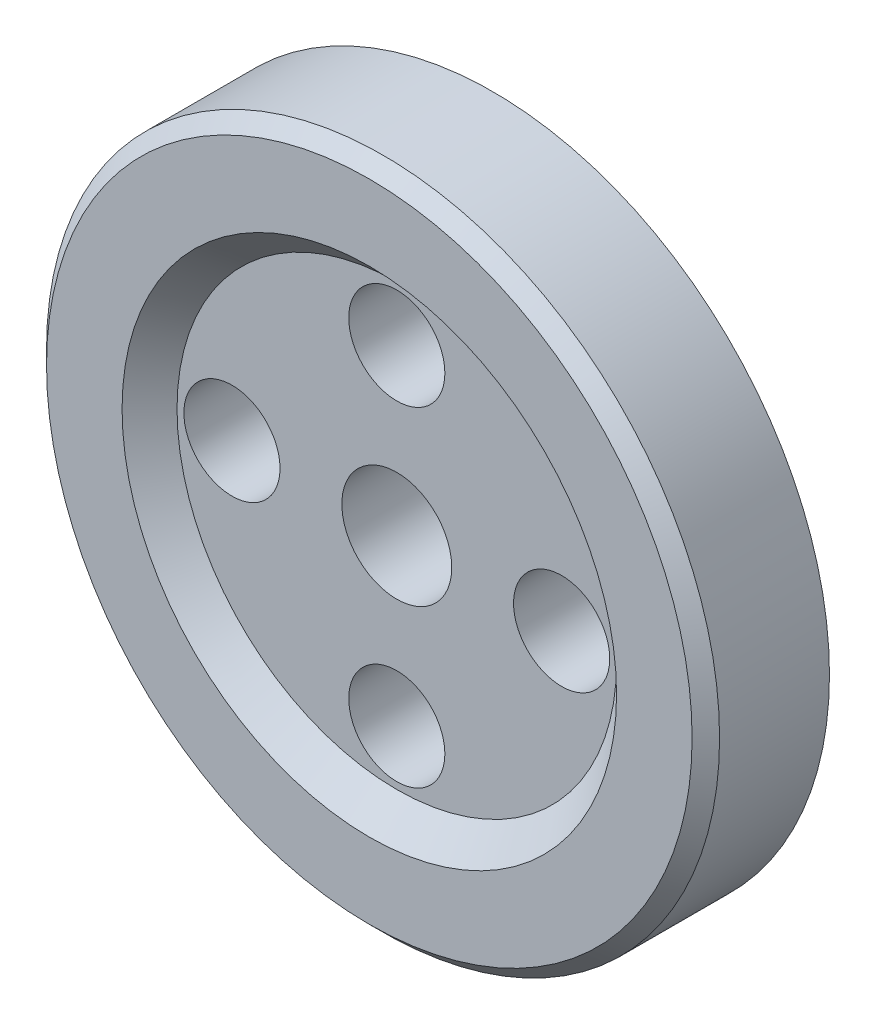
ISO-10303-21;
HEADER;
FILE_DESCRIPTION(('STEP AP214'),'2;1');
FILE_NAME('part.step','',(''),(''),'','','');
FILE_SCHEMA(('AUTOMOTIVE_DESIGN { 1 0 10303 214 1 1 1 1 }'));
ENDSEC;
DATA;
#1=APPLICATION_CONTEXT('core data for automotive mechanical design processes');
#2=APPLICATION_PROTOCOL_DEFINITION('international standard','automotive_design',2000,#1);
#3=PRODUCT_CONTEXT('',#1,'mechanical');
#4=PRODUCT('Part','Part','',(#3));
#5=PRODUCT_RELATED_PRODUCT_CATEGORY('part','',(#4));
#6=PRODUCT_DEFINITION_FORMATION('','',#4);
#7=PRODUCT_DEFINITION_CONTEXT('part definition',#1,'design');
#8=PRODUCT_DEFINITION('design','',#6,#7);
#9=PRODUCT_DEFINITION_SHAPE('','',#8);
#10=(LENGTH_UNIT() NAMED_UNIT(*) SI_UNIT(.MILLI.,.METRE.));
#11=(NAMED_UNIT(*) PLANE_ANGLE_UNIT() SI_UNIT($,.RADIAN.));
#12=(NAMED_UNIT(*) SI_UNIT($,.STERADIAN.) SOLID_ANGLE_UNIT());
#13=UNCERTAINTY_MEASURE_WITH_UNIT(LENGTH_MEASURE(1.E-05),#10,'distance_accuracy_value','');
#14=(GEOMETRIC_REPRESENTATION_CONTEXT(3) GLOBAL_UNCERTAINTY_ASSIGNED_CONTEXT((#13)) GLOBAL_UNIT_ASSIGNED_CONTEXT((#10,
#11,#12)) REPRESENTATION_CONTEXT('',''));
#15=CARTESIAN_POINT('',(0.,0.,0.));
#16=DIRECTION('',(0.,0.,1.));
#17=DIRECTION('',(1.,0.,0.));
#18=AXIS2_PLACEMENT_3D('',#15,#16,#17);
#19=CARTESIAN_POINT('',(0.,12.,4.5));
#20=DIRECTION('',(0.,0.,-1.));
#21=DIRECTION('',(-1.,0.,0.));
#22=AXIS2_PLACEMENT_3D('',#19,#20,#21);
#23=CYLINDRICAL_SURFACE('',#22,3.5);
#24=CARTESIAN_POINT('',(0.,12.,-4.5));
#25=DIRECTION('',(0.,0.,1.));
#26=DIRECTION('',(1.,0.,0.));
#27=AXIS2_PLACEMENT_3D('',#24,#25,#26);
#28=CIRCLE('',#27,3.5);
#29=CARTESIAN_POINT('',(3.5,12.,-4.5));
#30=VERTEX_POINT('',#29);
#31=EDGE_CURVE('E60',#30,#30,#28,.T.);
#32=ORIENTED_EDGE('',*,*,#31,.F.);
#33=EDGE_LOOP('',(#32));
#34=FACE_BOUND('',#33,.T.);
#35=CARTESIAN_POINT('',(0.,12.,2.5));
#36=DIRECTION('',(0.,0.,1.));
#37=DIRECTION('',(1.,0.,0.));
#38=AXIS2_PLACEMENT_3D('',#35,#36,#37);
#39=CIRCLE('',#38,3.5);
#40=CARTESIAN_POINT('',(3.5,12.,2.5));
#41=VERTEX_POINT('',#40);
#42=EDGE_CURVE('E75',#41,#41,#39,.T.);
#43=ORIENTED_EDGE('',*,*,#42,.T.);
#44=EDGE_LOOP('',(#43));
#45=FACE_BOUND('',#44,.T.);
#46=ADVANCED_FACE('F34',(#34,#45),#23,.F.);
#47=CARTESIAN_POINT('',(-12.,0.,4.5));
#48=DIRECTION('',(0.,0.,-1.));
#49=DIRECTION('',(-1.,0.,0.));
#50=AXIS2_PLACEMENT_3D('',#47,#48,#49);
#51=CYLINDRICAL_SURFACE('',#50,3.5);
#52=CARTESIAN_POINT('',(-12.,0.,-4.5));
#53=DIRECTION('',(0.,0.,1.));
#54=DIRECTION('',(1.,0.,0.));
#55=AXIS2_PLACEMENT_3D('',#52,#53,#54);
#56=CIRCLE('',#55,3.5);
#57=CARTESIAN_POINT('',(-8.5,0.,-4.5));
#58=VERTEX_POINT('',#57);
#59=EDGE_CURVE('E63',#58,#58,#56,.T.);
#60=ORIENTED_EDGE('',*,*,#59,.F.);
#61=EDGE_LOOP('',(#60));
#62=FACE_BOUND('',#61,.T.);
#63=CARTESIAN_POINT('',(-12.,0.,2.5));
#64=DIRECTION('',(0.,0.,1.));
#65=DIRECTION('',(1.,0.,0.));
#66=AXIS2_PLACEMENT_3D('',#63,#64,#65);
#67=CIRCLE('',#66,3.5);
#68=CARTESIAN_POINT('',(-8.5,0.,2.5));
#69=VERTEX_POINT('',#68);
#70=EDGE_CURVE('E78',#69,#69,#67,.T.);
#71=ORIENTED_EDGE('',*,*,#70,.T.);
#72=EDGE_LOOP('',(#71));
#73=FACE_BOUND('',#72,.T.);
#74=ADVANCED_FACE('F106',(#62,#73),#51,.F.);
#75=CARTESIAN_POINT('',(0.,-12.,4.5));
#76=DIRECTION('',(0.,0.,-1.));
#77=DIRECTION('',(-1.,0.,0.));
#78=AXIS2_PLACEMENT_3D('',#75,#76,#77);
#79=CYLINDRICAL_SURFACE('',#78,3.5);
#80=CARTESIAN_POINT('',(0.,-12.,-4.5));
#81=DIRECTION('',(0.,0.,1.));
#82=DIRECTION('',(1.,0.,0.));
#83=AXIS2_PLACEMENT_3D('',#80,#81,#82);
#84=CIRCLE('',#83,3.5);
#85=CARTESIAN_POINT('',(3.5,-12.,-4.5));
#86=VERTEX_POINT('',#85);
#87=EDGE_CURVE('E66',#86,#86,#84,.T.);
#88=ORIENTED_EDGE('',*,*,#87,.F.);
#89=EDGE_LOOP('',(#88));
#90=FACE_BOUND('',#89,.T.);
#91=CARTESIAN_POINT('',(0.,-12.,2.5));
#92=DIRECTION('',(0.,0.,1.));
#93=DIRECTION('',(1.,0.,0.));
#94=AXIS2_PLACEMENT_3D('',#91,#92,#93);
#95=CIRCLE('',#94,3.5);
#96=CARTESIAN_POINT('',(3.5,-12.,2.5));
#97=VERTEX_POINT('',#96);
#98=EDGE_CURVE('E81',#97,#97,#95,.T.);
#99=ORIENTED_EDGE('',*,*,#98,.T.);
#100=EDGE_LOOP('',(#99));
#101=FACE_BOUND('',#100,.T.);
#102=ADVANCED_FACE('F112',(#90,#101),#79,.F.);
#103=CARTESIAN_POINT('',(12.,0.,4.5));
#104=DIRECTION('',(0.,0.,-1.));
#105=DIRECTION('',(-1.,0.,0.));
#106=AXIS2_PLACEMENT_3D('',#103,#104,#105);
#107=CYLINDRICAL_SURFACE('',#106,3.5);
#108=CARTESIAN_POINT('',(12.,0.,-4.5));
#109=DIRECTION('',(0.,0.,1.));
#110=DIRECTION('',(1.,0.,0.));
#111=AXIS2_PLACEMENT_3D('',#108,#109,#110);
#112=CIRCLE('',#111,3.5);
#113=CARTESIAN_POINT('',(15.5,0.,-4.5));
#114=VERTEX_POINT('',#113);
#115=EDGE_CURVE('E69',#114,#114,#112,.T.);
#116=ORIENTED_EDGE('',*,*,#115,.F.);
#117=EDGE_LOOP('',(#116));
#118=FACE_BOUND('',#117,.T.);
#119=CARTESIAN_POINT('',(12.,0.,2.5));
#120=DIRECTION('',(0.,0.,1.));
#121=DIRECTION('',(1.,0.,0.));
#122=AXIS2_PLACEMENT_3D('',#119,#120,#121);
#123=CIRCLE('',#122,3.5);
#124=CARTESIAN_POINT('',(15.5,0.,2.5));
#125=VERTEX_POINT('',#124);
#126=EDGE_CURVE('E56',#125,#125,#123,.T.);
#127=ORIENTED_EDGE('',*,*,#126,.T.);
#128=EDGE_LOOP('',(#127));
#129=FACE_BOUND('',#128,.T.);
#130=ADVANCED_FACE('F143',(#118,#129),#107,.F.);
#131=CARTESIAN_POINT('',(0.,0.,4.5));
#132=DIRECTION('',(0.,0.,-1.));
#133=DIRECTION('',(-1.,0.,0.));
#134=AXIS2_PLACEMENT_3D('',#131,#132,#133);
#135=CYLINDRICAL_SURFACE('',#134,4.);
#136=CARTESIAN_POINT('',(0.,0.,-4.5));
#137=DIRECTION('',(0.,0.,1.));
#138=DIRECTION('',(1.,0.,0.));
#139=AXIS2_PLACEMENT_3D('',#136,#137,#138);
#140=CIRCLE('',#139,4.);
#141=CARTESIAN_POINT('',(4.,0.,-4.5));
#142=VERTEX_POINT('',#141);
#143=EDGE_CURVE('E72',#142,#142,#140,.T.);
#144=ORIENTED_EDGE('',*,*,#143,.F.);
#145=EDGE_LOOP('',(#144));
#146=FACE_BOUND('',#145,.T.);
#147=CARTESIAN_POINT('',(0.,0.,2.5));
#148=DIRECTION('',(0.,0.,1.));
#149=DIRECTION('',(1.,0.,0.));
#150=AXIS2_PLACEMENT_3D('',#147,#148,#149);
#151=CIRCLE('',#150,4.);
#152=CARTESIAN_POINT('',(4.,0.,2.5));
#153=VERTEX_POINT('',#152);
#154=EDGE_CURVE('E53',#153,#153,#151,.T.);
#155=ORIENTED_EDGE('',*,*,#154,.T.);
#156=EDGE_LOOP('',(#155));
#157=FACE_BOUND('',#156,.T.);
#158=ADVANCED_FACE('F123',(#146,#157),#135,.F.);
#159=CARTESIAN_POINT('',(0.,0.,4.5));
#160=DIRECTION('',(0.,0.,1.));
#161=DIRECTION('',(1.,0.,0.));
#162=AXIS2_PLACEMENT_3D('',#159,#160,#161);
#163=PLANE('',#162);
#164=CARTESIAN_POINT('',(0.,0.,4.5));
#165=DIRECTION('',(0.,0.,1.));
#166=DIRECTION('',(1.,0.,0.));
#167=AXIS2_PLACEMENT_3D('',#164,#165,#166);
#168=CIRCLE('',#167,23.5);
#169=CARTESIAN_POINT('',(23.5,0.,4.5));
#170=VERTEX_POINT('',#169);
#171=EDGE_CURVE('E42',#170,#170,#168,.T.);
#172=ORIENTED_EDGE('',*,*,#171,.T.);
#173=EDGE_LOOP('',(#172));
#174=FACE_BOUND('',#173,.T.);
#175=CARTESIAN_POINT('',(0.,0.,4.5));
#176=DIRECTION('',(0.,0.,1.));
#177=DIRECTION('',(1.,0.,0.));
#178=AXIS2_PLACEMENT_3D('',#175,#176,#177);
#179=CIRCLE('',#178,18.);
#180=CARTESIAN_POINT('',(18.,0.,4.5));
#181=VERTEX_POINT('',#180);
#182=EDGE_CURVE('E46',#181,#181,#179,.F.);
#183=ORIENTED_EDGE('',*,*,#182,.T.);
#184=EDGE_LOOP('',(#183));
#185=FACE_BOUND('',#184,.T.);
#186=ADVANCED_FACE('F119',(#174,#185),#163,.T.);
#187=CARTESIAN_POINT('',(0.,0.,-4.5));
#188=DIRECTION('',(0.,0.,1.));
#189=DIRECTION('',(1.,0.,0.));
#190=AXIS2_PLACEMENT_3D('',#187,#188,#189);
#191=PLANE('',#190);
#192=CARTESIAN_POINT('',(0.,0.,-4.5));
#193=DIRECTION('',(0.,0.,1.));
#194=DIRECTION('',(1.,0.,0.));
#195=AXIS2_PLACEMENT_3D('',#192,#193,#194);
#196=CIRCLE('',#195,24.5);
#197=CARTESIAN_POINT('',(24.5,0.,-4.5));
#198=VERTEX_POINT('',#197);
#199=EDGE_CURVE('E50',#198,#198,#196,.T.);
#200=ORIENTED_EDGE('',*,*,#199,.F.);
#201=EDGE_LOOP('',(#200));
#202=FACE_BOUND('',#201,.T.);
#203=ORIENTED_EDGE('',*,*,#31,.T.);
#204=EDGE_LOOP('',(#203));
#205=FACE_BOUND('',#204,.T.);
#206=ORIENTED_EDGE('',*,*,#59,.T.);
#207=EDGE_LOOP('',(#206));
#208=FACE_BOUND('',#207,.T.);
#209=ORIENTED_EDGE('',*,*,#87,.T.);
#210=EDGE_LOOP('',(#209));
#211=FACE_BOUND('',#210,.T.);
#212=ORIENTED_EDGE('',*,*,#115,.T.);
#213=EDGE_LOOP('',(#212));
#214=FACE_BOUND('',#213,.T.);
#215=ORIENTED_EDGE('',*,*,#143,.T.);
#216=EDGE_LOOP('',(#215));
#217=FACE_BOUND('',#216,.T.);
#218=ADVANCED_FACE('F122',(#202,#205,#208,#211,#214,#217),#191,.F.);
#219=CARTESIAN_POINT('',(0.,0.,4.5));
#220=DIRECTION('',(0.,0.,-1.));
#221=DIRECTION('',(-1.,0.,0.));
#222=AXIS2_PLACEMENT_3D('',#219,#220,#221);
#223=CYLINDRICAL_SURFACE('',#222,24.5);
#224=CARTESIAN_POINT('',(0.,0.,3.49999999999999));
#225=DIRECTION('',(0.,0.,1.));
#226=DIRECTION('',(1.,0.,0.));
#227=AXIS2_PLACEMENT_3D('',#224,#225,#226);
#228=CIRCLE('',#227,24.5);
#229=CARTESIAN_POINT('',(24.5,0.,3.49999999999999));
#230=VERTEX_POINT('',#229);
#231=EDGE_CURVE('E10',#230,#230,#228,.F.);
#232=ORIENTED_EDGE('',*,*,#231,.T.);
#233=EDGE_LOOP('',(#232));
#234=FACE_BOUND('',#233,.T.);
#235=ORIENTED_EDGE('',*,*,#199,.T.);
#236=EDGE_LOOP('',(#235));
#237=FACE_BOUND('',#236,.T.);
#238=ADVANCED_FACE('F99',(#234,#237),#223,.T.);
#239=CARTESIAN_POINT('',(0.,0.,2.5));
#240=DIRECTION('',(0.,0.,1.));
#241=DIRECTION('',(1.,0.,0.));
#242=AXIS2_PLACEMENT_3D('',#239,#240,#241);
#243=PLANE('',#242);
#244=ORIENTED_EDGE('',*,*,#42,.F.);
#245=EDGE_LOOP('',(#244));
#246=FACE_BOUND('',#245,.T.);
#247=ORIENTED_EDGE('',*,*,#70,.F.);
#248=EDGE_LOOP('',(#247));
#249=FACE_BOUND('',#248,.T.);
#250=ORIENTED_EDGE('',*,*,#98,.F.);
#251=EDGE_LOOP('',(#250));
#252=FACE_BOUND('',#251,.T.);
#253=ORIENTED_EDGE('',*,*,#126,.F.);
#254=EDGE_LOOP('',(#253));
#255=FACE_BOUND('',#254,.T.);
#256=ORIENTED_EDGE('',*,*,#154,.F.);
#257=EDGE_LOOP('',(#256));
#258=FACE_BOUND('',#257,.T.);
#259=CARTESIAN_POINT('',(0.,0.,2.5));
#260=DIRECTION('',(0.,0.,1.));
#261=DIRECTION('',(1.,0.,0.));
#262=AXIS2_PLACEMENT_3D('',#259,#260,#261);
#263=CIRCLE('',#262,16.);
#264=CARTESIAN_POINT('',(16.,0.,2.5));
#265=VERTEX_POINT('',#264);
#266=EDGE_CURVE('E57',#265,#265,#263,.T.);
#267=ORIENTED_EDGE('',*,*,#266,.T.);
#268=EDGE_LOOP('',(#267));
#269=FACE_BOUND('',#268,.T.);
#270=ADVANCED_FACE('F89',(#246,#249,#252,#255,#258,#269),#243,.T.);
#271=CARTESIAN_POINT('',(0.,0.,2.49999999999999));
#272=DIRECTION('',(0.,0.,1.));
#273=DIRECTION('',(1.,0.,0.));
#274=AXIS2_PLACEMENT_3D('',#271,#272,#273);
#275=CONICAL_SURFACE('',#274,16.,0.785398163397452);
#276=ORIENTED_EDGE('',*,*,#182,.F.);
#277=EDGE_LOOP('',(#276));
#278=FACE_BOUND('',#277,.T.);
#279=ORIENTED_EDGE('',*,*,#266,.F.);
#280=EDGE_LOOP('',(#279));
#281=FACE_BOUND('',#280,.T.);
#282=ADVANCED_FACE('F91',(#278,#281),#275,.F.);
#283=CARTESIAN_POINT('',(0.,0.,4.5));
#284=DIRECTION('',(0.,0.,-1.));
#285=DIRECTION('',(-1.,0.,0.));
#286=AXIS2_PLACEMENT_3D('',#283,#284,#285);
#287=CONICAL_SURFACE('',#286,23.5,0.785398163397443);
#288=ORIENTED_EDGE('',*,*,#231,.F.);
#289=EDGE_LOOP('',(#288));
#290=FACE_BOUND('',#289,.T.);
#291=ORIENTED_EDGE('',*,*,#171,.F.);
#292=EDGE_LOOP('',(#291));
#293=FACE_BOUND('',#292,.T.);
#294=ADVANCED_FACE('F37',(#290,#293),#287,.T.);
#295=CLOSED_SHELL('',(#46,#74,#102,#130,#158,#186,#218,#238,#270,#282,#294));
#296=MANIFOLD_SOLID_BREP('B2',#295);
#297=ADVANCED_BREP_SHAPE_REPRESENTATION('',(#18,#296),#14);
#298=SHAPE_DEFINITION_REPRESENTATION(#9,#297);
ENDSEC;
END-ISO-10303-21;
